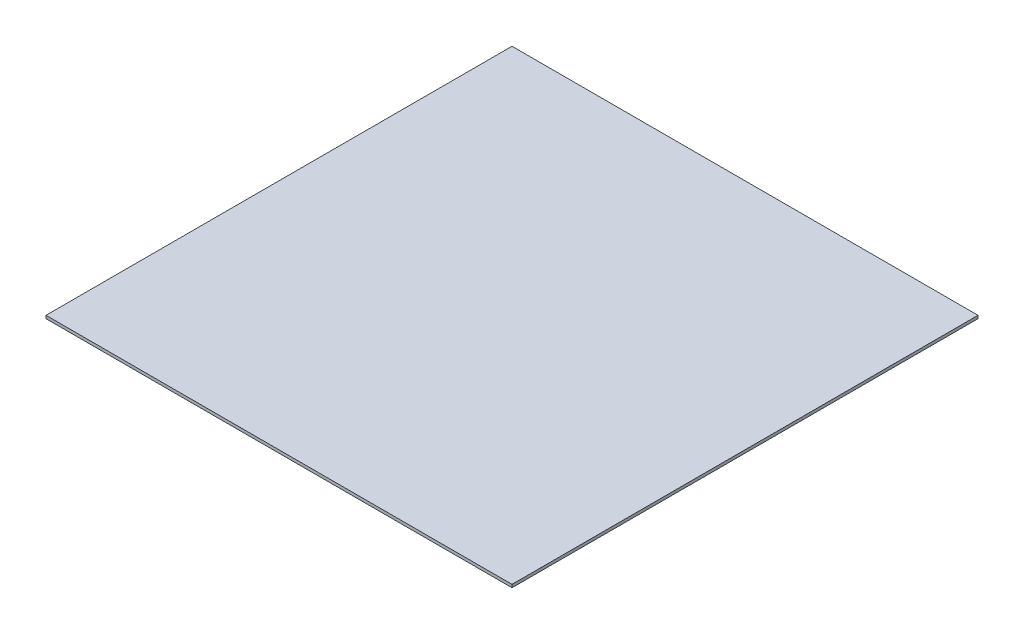
ISO-10303-21;
HEADER;
FILE_DESCRIPTION(('STEP AP214'),'2;1');
FILE_NAME('part.step','',(''),(''),'','','');
FILE_SCHEMA(('AUTOMOTIVE_DESIGN { 1 0 10303 214 1 1 1 1 }'));
ENDSEC;
DATA;
#1=APPLICATION_CONTEXT('core data for automotive mechanical design processes');
#2=APPLICATION_PROTOCOL_DEFINITION('international standard','automotive_design',2000,#1);
#3=PRODUCT_CONTEXT('',#1,'mechanical');
#4=PRODUCT('Part','Part','',(#3));
#5=PRODUCT_RELATED_PRODUCT_CATEGORY('part','',(#4));
#6=PRODUCT_DEFINITION_FORMATION('','',#4);
#7=PRODUCT_DEFINITION_CONTEXT('part definition',#1,'design');
#8=PRODUCT_DEFINITION('design','',#6,#7);
#9=PRODUCT_DEFINITION_SHAPE('','',#8);
#10=(LENGTH_UNIT() NAMED_UNIT(*) SI_UNIT(.MILLI.,.METRE.));
#11=(NAMED_UNIT(*) PLANE_ANGLE_UNIT() SI_UNIT($,.RADIAN.));
#12=(NAMED_UNIT(*) SI_UNIT($,.STERADIAN.) SOLID_ANGLE_UNIT());
#13=UNCERTAINTY_MEASURE_WITH_UNIT(LENGTH_MEASURE(1.E-05),#10,'distance_accuracy_value','');
#14=(GEOMETRIC_REPRESENTATION_CONTEXT(3) GLOBAL_UNCERTAINTY_ASSIGNED_CONTEXT((#13)) GLOBAL_UNIT_ASSIGNED_CONTEXT((#10,
#11,#12)) REPRESENTATION_CONTEXT('',''));
#15=CARTESIAN_POINT('',(0.,0.,0.));
#16=DIRECTION('',(0.,0.,1.));
#17=DIRECTION('',(1.,0.,0.));
#18=AXIS2_PLACEMENT_3D('',#15,#16,#17);
#19=CARTESIAN_POINT('',(0.,6.35,0.));
#20=DIRECTION('',(1.,0.,0.));
#21=DIRECTION('',(0.,0.,-1.));
#22=AXIS2_PLACEMENT_3D('',#19,#20,#21);
#23=PLANE('',#22);
#24=DIRECTION('',(0.,0.,1.));
#25=VECTOR('',#24,1.);
#26=CARTESIAN_POINT('',(0.,0.,0.));
#27=LINE('',#26,#25);
#28=CARTESIAN_POINT('',(0.,0.,-1000.));
#29=VERTEX_POINT('',#28);
#30=CARTESIAN_POINT('',(0.,0.,0.));
#31=VERTEX_POINT('',#30);
#32=EDGE_CURVE('E96',#29,#31,#27,.T.);
#33=ORIENTED_EDGE('',*,*,#32,.T.);
#34=DIRECTION('',(0.,-1.,0.));
#35=VECTOR('',#34,1.);
#36=CARTESIAN_POINT('',(0.,6.35,0.));
#37=LINE('',#36,#35);
#38=CARTESIAN_POINT('',(0.,6.35,0.));
#39=VERTEX_POINT('',#38);
#40=EDGE_CURVE('E11',#39,#31,#37,.T.);
#41=ORIENTED_EDGE('',*,*,#40,.F.);
#42=DIRECTION('',(0.,0.,1.));
#43=VECTOR('',#42,1.);
#44=CARTESIAN_POINT('',(0.,6.35,0.));
#45=LINE('',#44,#43);
#46=CARTESIAN_POINT('',(0.,6.35,-1000.));
#47=VERTEX_POINT('',#46);
#48=EDGE_CURVE('E84',#47,#39,#45,.T.);
#49=ORIENTED_EDGE('',*,*,#48,.F.);
#50=DIRECTION('',(0.,-1.,0.));
#51=VECTOR('',#50,1.);
#52=CARTESIAN_POINT('',(0.,6.35,-1000.));
#53=LINE('',#52,#51);
#54=EDGE_CURVE('E92',#47,#29,#53,.T.);
#55=ORIENTED_EDGE('',*,*,#54,.T.);
#56=EDGE_LOOP('',(#33,#41,#49,#55));
#57=FACE_BOUND('',#56,.T.);
#58=ADVANCED_FACE('F33',(#57),#23,.F.);
#59=CARTESIAN_POINT('',(0.,6.35,0.));
#60=DIRECTION('',(0.,0.,-1.));
#61=DIRECTION('',(-1.,0.,0.));
#62=AXIS2_PLACEMENT_3D('',#59,#60,#61);
#63=PLANE('',#62);
#64=DIRECTION('',(1.,0.,0.));
#65=VECTOR('',#64,1.);
#66=CARTESIAN_POINT('',(0.,0.,0.));
#67=LINE('',#66,#65);
#68=CARTESIAN_POINT('',(1000.,0.,0.));
#69=VERTEX_POINT('',#68);
#70=EDGE_CURVE('E88',#31,#69,#67,.T.);
#71=ORIENTED_EDGE('',*,*,#70,.T.);
#72=DIRECTION('',(0.,-1.,0.));
#73=VECTOR('',#72,1.);
#74=CARTESIAN_POINT('',(1000.,6.35,0.));
#75=LINE('',#74,#73);
#76=CARTESIAN_POINT('',(1000.,6.35,0.));
#77=VERTEX_POINT('',#76);
#78=EDGE_CURVE('E41',#77,#69,#75,.T.);
#79=ORIENTED_EDGE('',*,*,#78,.F.);
#80=DIRECTION('',(1.,0.,0.));
#81=VECTOR('',#80,1.);
#82=CARTESIAN_POINT('',(0.,6.35,0.));
#83=LINE('',#82,#81);
#84=EDGE_CURVE('E79',#39,#77,#83,.T.);
#85=ORIENTED_EDGE('',*,*,#84,.F.);
#86=ORIENTED_EDGE('',*,*,#40,.T.);
#87=EDGE_LOOP('',(#71,#79,#85,#86));
#88=FACE_BOUND('',#87,.T.);
#89=ADVANCED_FACE('F87',(#88),#63,.F.);
#90=CARTESIAN_POINT('',(1000.,6.35,0.));
#91=DIRECTION('',(-1.,0.,0.));
#92=DIRECTION('',(0.,0.,1.));
#93=AXIS2_PLACEMENT_3D('',#90,#91,#92);
#94=PLANE('',#93);
#95=DIRECTION('',(0.,0.,-1.));
#96=VECTOR('',#95,1.);
#97=CARTESIAN_POINT('',(1000.,0.,0.));
#98=LINE('',#97,#96);
#99=CARTESIAN_POINT('',(1000.,0.,-1000.));
#100=VERTEX_POINT('',#99);
#101=EDGE_CURVE('E66',#69,#100,#98,.T.);
#102=ORIENTED_EDGE('',*,*,#101,.T.);
#103=DIRECTION('',(0.,-1.,0.));
#104=VECTOR('',#103,1.);
#105=CARTESIAN_POINT('',(1000.,6.35,-1000.));
#106=LINE('',#105,#104);
#107=CARTESIAN_POINT('',(1000.,6.35,-1000.));
#108=VERTEX_POINT('',#107);
#109=EDGE_CURVE('E89',#108,#100,#106,.T.);
#110=ORIENTED_EDGE('',*,*,#109,.F.);
#111=DIRECTION('',(0.,0.,-1.));
#112=VECTOR('',#111,1.);
#113=CARTESIAN_POINT('',(1000.,6.35,0.));
#114=LINE('',#113,#112);
#115=EDGE_CURVE('E82',#77,#108,#114,.T.);
#116=ORIENTED_EDGE('',*,*,#115,.F.);
#117=ORIENTED_EDGE('',*,*,#78,.T.);
#118=EDGE_LOOP('',(#102,#110,#116,#117));
#119=FACE_BOUND('',#118,.T.);
#120=ADVANCED_FACE('F90',(#119),#94,.F.);
#121=CARTESIAN_POINT('',(0.,6.35,-1000.));
#122=DIRECTION('',(0.,0.,1.));
#123=DIRECTION('',(1.,0.,0.));
#124=AXIS2_PLACEMENT_3D('',#121,#122,#123);
#125=PLANE('',#124);
#126=DIRECTION('',(-1.,0.,0.));
#127=VECTOR('',#126,1.);
#128=CARTESIAN_POINT('',(0.,0.,-1000.));
#129=LINE('',#128,#127);
#130=EDGE_CURVE('E72',#100,#29,#129,.T.);
#131=ORIENTED_EDGE('',*,*,#130,.T.);
#132=ORIENTED_EDGE('',*,*,#54,.F.);
#133=DIRECTION('',(-1.,0.,0.));
#134=VECTOR('',#133,1.);
#135=CARTESIAN_POINT('',(0.,6.35,-1000.));
#136=LINE('',#135,#134);
#137=EDGE_CURVE('E49',#108,#47,#136,.T.);
#138=ORIENTED_EDGE('',*,*,#137,.F.);
#139=ORIENTED_EDGE('',*,*,#109,.T.);
#140=EDGE_LOOP('',(#131,#132,#138,#139));
#141=FACE_BOUND('',#140,.T.);
#142=ADVANCED_FACE('F103',(#141),#125,.F.);
#143=CARTESIAN_POINT('',(0.,6.35,0.));
#144=DIRECTION('',(0.,-1.,0.));
#145=DIRECTION('',(0.,0.,-1.));
#146=AXIS2_PLACEMENT_3D('',#143,#144,#145);
#147=PLANE('',#146);
#148=ORIENTED_EDGE('',*,*,#48,.T.);
#149=ORIENTED_EDGE('',*,*,#84,.T.);
#150=ORIENTED_EDGE('',*,*,#115,.T.);
#151=ORIENTED_EDGE('',*,*,#137,.T.);
#152=EDGE_LOOP('',(#148,#149,#150,#151));
#153=FACE_BOUND('',#152,.T.);
#154=ADVANCED_FACE('F80',(#153),#147,.F.);
#155=CARTESIAN_POINT('',(0.,0.,0.));
#156=DIRECTION('',(0.,-1.,0.));
#157=DIRECTION('',(0.,0.,-1.));
#158=AXIS2_PLACEMENT_3D('',#155,#156,#157);
#159=PLANE('',#158);
#160=ORIENTED_EDGE('',*,*,#32,.F.);
#161=ORIENTED_EDGE('',*,*,#130,.F.);
#162=ORIENTED_EDGE('',*,*,#101,.F.);
#163=ORIENTED_EDGE('',*,*,#70,.F.);
#164=EDGE_LOOP('',(#160,#161,#162,#163));
#165=FACE_BOUND('',#164,.T.);
#166=ADVANCED_FACE('F106',(#165),#159,.T.);
#167=CLOSED_SHELL('',(#58,#89,#120,#142,#154,#166));
#168=MANIFOLD_SOLID_BREP('B2',#167);
#169=ADVANCED_BREP_SHAPE_REPRESENTATION('',(#18,#168),#14);
#170=SHAPE_DEFINITION_REPRESENTATION(#9,#169);
ENDSEC;
END-ISO-10303-21;
